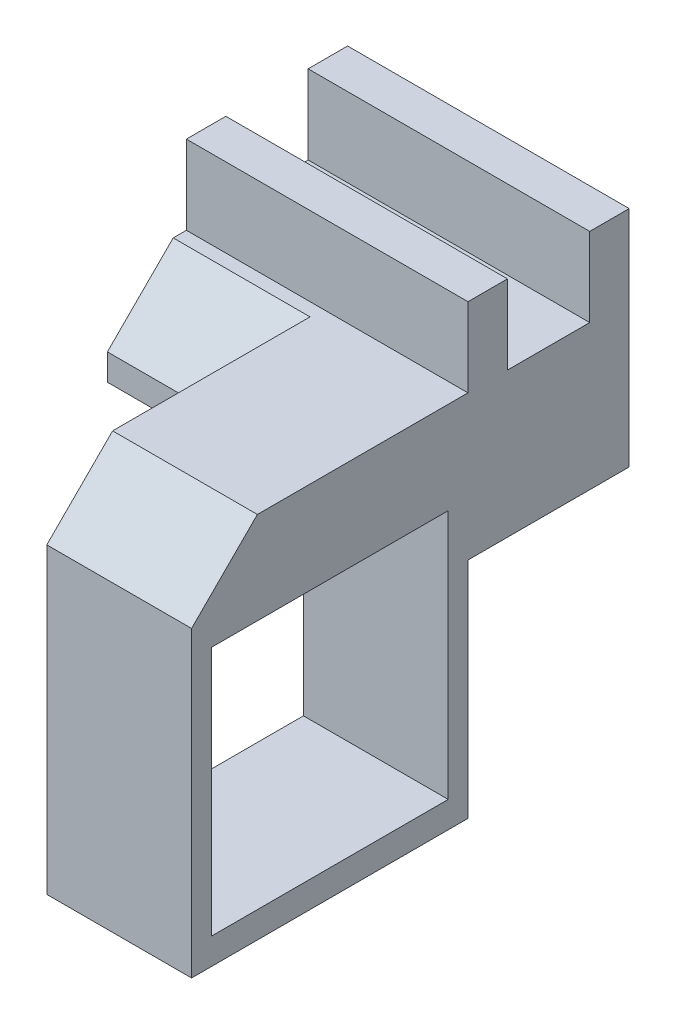
ISO-10303-21;
HEADER;
FILE_DESCRIPTION(('STEP AP214'),'2;1');
FILE_NAME('part.step','',(''),(''),'','','');
FILE_SCHEMA(('AUTOMOTIVE_DESIGN { 1 0 10303 214 1 1 1 1 }'));
ENDSEC;
DATA;
#1=APPLICATION_CONTEXT('core data for automotive mechanical design processes');
#2=APPLICATION_PROTOCOL_DEFINITION('international standard','automotive_design',2000,#1);
#3=PRODUCT_CONTEXT('',#1,'mechanical');
#4=PRODUCT('Part','Part','',(#3));
#5=PRODUCT_RELATED_PRODUCT_CATEGORY('part','',(#4));
#6=PRODUCT_DEFINITION_FORMATION('','',#4);
#7=PRODUCT_DEFINITION_CONTEXT('part definition',#1,'design');
#8=PRODUCT_DEFINITION('design','',#6,#7);
#9=PRODUCT_DEFINITION_SHAPE('','',#8);
#10=(LENGTH_UNIT() NAMED_UNIT(*) SI_UNIT(.MILLI.,.METRE.));
#11=(NAMED_UNIT(*) PLANE_ANGLE_UNIT() SI_UNIT($,.RADIAN.));
#12=(NAMED_UNIT(*) SI_UNIT($,.STERADIAN.) SOLID_ANGLE_UNIT());
#13=UNCERTAINTY_MEASURE_WITH_UNIT(LENGTH_MEASURE(1.E-05),#10,'distance_accuracy_value','');
#14=(GEOMETRIC_REPRESENTATION_CONTEXT(3) GLOBAL_UNCERTAINTY_ASSIGNED_CONTEXT((#13)) GLOBAL_UNIT_ASSIGNED_CONTEXT((#10,
#11,#12)) REPRESENTATION_CONTEXT('',''));
#15=CARTESIAN_POINT('',(0.,0.,0.));
#16=DIRECTION('',(0.,0.,1.));
#17=DIRECTION('',(1.,0.,0.));
#18=AXIS2_PLACEMENT_3D('',#15,#16,#17);
#19=CARTESIAN_POINT('',(0.,11.,0.));
#20=DIRECTION('',(0.,1.,0.));
#21=DIRECTION('',(0.,0.,1.));
#22=AXIS2_PLACEMENT_3D('',#19,#20,#21);
#23=PLANE('',#22);
#24=DIRECTION('',(0.,0.,-1.));
#25=VECTOR('',#24,1.);
#26=CARTESIAN_POINT('',(43.7350442610288,11.,18.5));
#27=LINE('',#26,#25);
#28=CARTESIAN_POINT('',(43.7350442610289,11.,50.5));
#29=VERTEX_POINT('',#28);
#30=CARTESIAN_POINT('',(43.7350442610289,11.,18.5));
#31=VERTEX_POINT('',#30);
#32=EDGE_CURVE('E234',#29,#31,#27,.T.);
#33=ORIENTED_EDGE('',*,*,#32,.T.);
#34=DIRECTION('',(-1.,0.,0.));
#35=VECTOR('',#34,1.);
#36=CARTESIAN_POINT('',(21.7350442610289,11.,18.5));
#37=LINE('',#36,#35);
#38=CARTESIAN_POINT('',(0.945063882776895,11.,18.5));
#39=VERTEX_POINT('',#38);
#40=EDGE_CURVE('E218',#31,#39,#37,.T.);
#41=ORIENTED_EDGE('',*,*,#40,.T.);
#42=DIRECTION('',(0.,0.,1.));
#43=VECTOR('',#42,1.);
#44=CARTESIAN_POINT('',(0.945063882776895,11.,18.5));
#45=LINE('',#44,#43);
#46=CARTESIAN_POINT('',(0.945063882776896,11.,20.5));
#47=VERTEX_POINT('',#46);
#48=EDGE_CURVE('E226',#39,#47,#45,.T.);
#49=ORIENTED_EDGE('',*,*,#48,.T.);
#50=DIRECTION('',(1.,0.,0.));
#51=VECTOR('',#50,1.);
#52=CARTESIAN_POINT('',(0.,11.,20.5));
#53=LINE('',#52,#51);
#54=CARTESIAN_POINT('',(21.7350442610289,11.,20.5));
#55=VERTEX_POINT('',#54);
#56=EDGE_CURVE('E411',#47,#55,#53,.T.);
#57=ORIENTED_EDGE('',*,*,#56,.T.);
#58=DIRECTION('',(0.,0.,1.));
#59=VECTOR('',#58,1.);
#60=CARTESIAN_POINT('',(21.7350442610289,11.,30.5));
#61=LINE('',#60,#59);
#62=CARTESIAN_POINT('',(21.7350442610289,11.,50.5));
#63=VERTEX_POINT('',#62);
#64=EDGE_CURVE('E268',#55,#63,#61,.T.);
#65=ORIENTED_EDGE('',*,*,#64,.T.);
#66=DIRECTION('',(1.,0.,0.));
#67=VECTOR('',#66,1.);
#68=CARTESIAN_POINT('',(0.,11.,50.5));
#69=LINE('',#68,#67);
#70=EDGE_CURVE('E246',#63,#29,#69,.T.);
#71=ORIENTED_EDGE('',*,*,#70,.T.);
#72=EDGE_LOOP('',(#33,#41,#49,#57,#65,#71));
#73=FACE_BOUND('',#72,.T.);
#74=ADVANCED_FACE('F72',(#73),#23,.T.);
#75=DIRECTION('',(1.,0.,0.));
#76=VECTOR('',#75,1.);
#77=CARTESIAN_POINT('',(0.945063882776894,11.,12.5));
#78=LINE('',#77,#76);
#79=CARTESIAN_POINT('',(0.945063882776894,11.,12.5));
#80=VERTEX_POINT('',#79);
#81=CARTESIAN_POINT('',(43.7350442610289,11.,12.5));
#82=VERTEX_POINT('',#81);
#83=EDGE_CURVE('E230',#80,#82,#78,.T.);
#84=ORIENTED_EDGE('',*,*,#83,.T.);
#85=CARTESIAN_POINT('',(43.7350442610289,11.,0.));
#86=VERTEX_POINT('',#85);
#87=EDGE_CURVE('E248',#82,#86,#27,.T.);
#88=ORIENTED_EDGE('',*,*,#87,.T.);
#89=DIRECTION('',(-1.,0.,0.));
#90=VECTOR('',#89,1.);
#91=CARTESIAN_POINT('',(21.7350442610289,11.,0.));
#92=LINE('',#91,#90);
#93=CARTESIAN_POINT('',(0.945063882776891,11.,0.));
#94=VERTEX_POINT('',#93);
#95=EDGE_CURVE('E247',#86,#94,#92,.T.);
#96=ORIENTED_EDGE('',*,*,#95,.T.);
#97=DIRECTION('',(0.,0.,1.));
#98=VECTOR('',#97,1.);
#99=CARTESIAN_POINT('',(0.945063882776891,11.,0.));
#100=LINE('',#99,#98);
#101=EDGE_CURVE('E254',#94,#80,#100,.T.);
#102=ORIENTED_EDGE('',*,*,#101,.T.);
#103=EDGE_LOOP('',(#84,#88,#96,#102));
#104=FACE_BOUND('',#103,.T.);
#105=ADVANCED_FACE('F518',(#104),#23,.T.);
#106=CARTESIAN_POINT('',(0.,-11.,0.));
#107=DIRECTION('',(0.,1.,0.));
#108=DIRECTION('',(0.,0.,1.));
#109=AXIS2_PLACEMENT_3D('',#106,#107,#108);
#110=PLANE('',#109);
#111=DIRECTION('',(0.,0.,-1.));
#112=VECTOR('',#111,1.);
#113=CARTESIAN_POINT('',(43.7350442610288,-11.,60.5));
#114=LINE('',#113,#112);
#115=CARTESIAN_POINT('',(43.7350442610288,-11.,18.5));
#116=VERTEX_POINT('',#115);
#117=CARTESIAN_POINT('',(43.7350442610288,-11.,-6.));
#118=VERTEX_POINT('',#117);
#119=EDGE_CURVE('E257',#116,#118,#114,.T.);
#120=ORIENTED_EDGE('',*,*,#119,.F.);
#121=DIRECTION('',(1.,0.,0.));
#122=VECTOR('',#121,1.);
#123=CARTESIAN_POINT('',(1.73504426102884,-11.,18.5));
#124=LINE('',#123,#122);
#125=CARTESIAN_POINT('',(21.7350442610289,-11.,18.5));
#126=VERTEX_POINT('',#125);
#127=EDGE_CURVE('E270',#126,#116,#124,.T.);
#128=ORIENTED_EDGE('',*,*,#127,.F.);
#129=DIRECTION('',(0.,0.,-1.));
#130=VECTOR('',#129,1.);
#131=CARTESIAN_POINT('',(21.7350442610289,-11.,30.5));
#132=LINE('',#131,#130);
#133=CARTESIAN_POINT('',(21.7350442610289,-11.,21.4999999999999));
#134=VERTEX_POINT('',#133);
#135=EDGE_CURVE('E377',#134,#126,#132,.T.);
#136=ORIENTED_EDGE('',*,*,#135,.F.);
#137=DIRECTION('',(-1.,0.,0.));
#138=VECTOR('',#137,1.);
#139=CARTESIAN_POINT('',(0.,-11.,21.4999999999999));
#140=LINE('',#139,#138);
#141=CARTESIAN_POINT('',(0.945063882776875,-11.,21.4999999999999));
#142=VERTEX_POINT('',#141);
#143=EDGE_CURVE('E303',#134,#142,#140,.T.);
#144=ORIENTED_EDGE('',*,*,#143,.T.);
#145=DIRECTION('',(0.,0.,1.));
#146=VECTOR('',#145,1.);
#147=CARTESIAN_POINT('',(0.945063882776895,-11.,18.5));
#148=LINE('',#147,#146);
#149=CARTESIAN_POINT('',(0.945063882776893,-11.,-6.));
#150=VERTEX_POINT('',#149);
#151=EDGE_CURVE('E369',#150,#142,#148,.T.);
#152=ORIENTED_EDGE('',*,*,#151,.F.);
#153=DIRECTION('',(1.,0.,0.));
#154=VECTOR('',#153,1.);
#155=CARTESIAN_POINT('',(0.,-11.,-6.));
#156=LINE('',#155,#154);
#157=EDGE_CURVE('E362',#150,#118,#156,.T.);
#158=ORIENTED_EDGE('',*,*,#157,.T.);
#159=EDGE_LOOP('',(#120,#128,#136,#144,#152,#158));
#160=FACE_BOUND('',#159,.T.);
#161=ADVANCED_FACE('F456',(#160),#110,.F.);
#162=CARTESIAN_POINT('',(0.945063882776893,23.,0.));
#163=DIRECTION('',(-1.,0.,0.));
#164=DIRECTION('',(0.,0.,1.));
#165=AXIS2_PLACEMENT_3D('',#162,#163,#164);
#166=PLANE('',#165);
#167=DIRECTION('',(0.,1.,0.));
#168=VECTOR('',#167,1.);
#169=CARTESIAN_POINT('',(0.945063882776898,-11.,30.5));
#170=LINE('',#169,#168);
#171=CARTESIAN_POINT('',(0.945063882776862,-3.,30.5));
#172=VERTEX_POINT('',#171);
#173=CARTESIAN_POINT('',(0.945063882776898,0.99999999999993,30.5));
#174=VERTEX_POINT('',#173);
#175=EDGE_CURVE('E366',#172,#174,#170,.T.);
#176=ORIENTED_EDGE('',*,*,#175,.T.);
#177=DIRECTION('',(0.,-0.707106781186549,0.707106781186546));
#178=VECTOR('',#177,1.);
#179=CARTESIAN_POINT('',(0.945063882776893,27.25,4.25000000000003));
#180=LINE('',#179,#178);
#181=EDGE_CURVE('E416',#174,#47,#180,.F.);
#182=ORIENTED_EDGE('',*,*,#181,.T.);
#183=ORIENTED_EDGE('',*,*,#48,.F.);
#184=DIRECTION('',(0.,-1.,0.));
#185=VECTOR('',#184,1.);
#186=CARTESIAN_POINT('',(0.945063882776895,23.,18.5));
#187=LINE('',#186,#185);
#188=CARTESIAN_POINT('',(0.945063882776895,23.,18.5));
#189=VERTEX_POINT('',#188);
#190=EDGE_CURVE('E224',#189,#39,#187,.T.);
#191=ORIENTED_EDGE('',*,*,#190,.F.);
#192=DIRECTION('',(0.,0.,1.));
#193=VECTOR('',#192,1.);
#194=CARTESIAN_POINT('',(0.945063882776893,23.,0.));
#195=LINE('',#194,#193);
#196=CARTESIAN_POINT('',(0.945063882776894,23.,12.5));
#197=VERTEX_POINT('',#196);
#198=EDGE_CURVE('E358',#197,#189,#195,.T.);
#199=ORIENTED_EDGE('',*,*,#198,.F.);
#200=DIRECTION('',(0.,-1.,0.));
#201=VECTOR('',#200,1.);
#202=CARTESIAN_POINT('',(0.945063882776894,23.,12.5));
#203=LINE('',#202,#201);
#204=EDGE_CURVE('E363',#197,#80,#203,.T.);
#205=ORIENTED_EDGE('',*,*,#204,.T.);
#206=ORIENTED_EDGE('',*,*,#101,.F.);
#207=DIRECTION('',(0.,-1.,0.));
#208=VECTOR('',#207,1.);
#209=CARTESIAN_POINT('',(0.945063882776893,23.,0.));
#210=LINE('',#209,#208);
#211=CARTESIAN_POINT('',(0.945063882776893,23.,0.));
#212=VERTEX_POINT('',#211);
#213=EDGE_CURVE('E398',#212,#94,#210,.T.);
#214=ORIENTED_EDGE('',*,*,#213,.F.);
#215=DIRECTION('',(0.,0.,-1.));
#216=VECTOR('',#215,1.);
#217=CARTESIAN_POINT('',(0.945063882776893,23.,0.));
#218=LINE('',#217,#216);
#219=CARTESIAN_POINT('',(0.945063882776893,23.,-6.));
#220=VERTEX_POINT('',#219);
#221=EDGE_CURVE('E389',#212,#220,#218,.T.);
#222=ORIENTED_EDGE('',*,*,#221,.T.);
#223=DIRECTION('',(0.,-1.,0.));
#224=VECTOR('',#223,1.);
#225=CARTESIAN_POINT('',(0.945063882776893,23.,-6.));
#226=LINE('',#225,#224);
#227=EDGE_CURVE('E396',#220,#150,#226,.T.);
#228=ORIENTED_EDGE('',*,*,#227,.T.);
#229=ORIENTED_EDGE('',*,*,#151,.T.);
#230=DIRECTION('',(0.,1.,0.));
#231=VECTOR('',#230,1.);
#232=CARTESIAN_POINT('',(0.945063882776875,0.,21.4999999999999));
#233=LINE('',#232,#231);
#234=CARTESIAN_POINT('',(0.945063882776875,-3.,21.4999999999999));
#235=VERTEX_POINT('',#234);
#236=EDGE_CURVE('E271',#142,#235,#233,.T.);
#237=ORIENTED_EDGE('',*,*,#236,.T.);
#238=DIRECTION('',(0.,0.,-1.));
#239=VECTOR('',#238,1.);
#240=CARTESIAN_POINT('',(0.945063882776889,-3.,0.));
#241=LINE('',#240,#239);
#242=EDGE_CURVE('E280',#172,#235,#241,.T.);
#243=ORIENTED_EDGE('',*,*,#242,.F.);
#244=EDGE_LOOP('',(#176,#182,#183,#191,#199,#205,#206,#214,#222,#228,#229,#237,#243));
#245=FACE_BOUND('',#244,.T.);
#246=ADVANCED_FACE('F463',(#245),#166,.T.);
#247=CARTESIAN_POINT('',(0.945063882776898,-11.,30.5));
#248=DIRECTION('',(0.,0.,1.));
#249=DIRECTION('',(1.,0.,0.));
#250=AXIS2_PLACEMENT_3D('',#247,#248,#249);
#251=PLANE('',#250);
#252=DIRECTION('',(0.,1.,0.));
#253=VECTOR('',#252,1.);
#254=CARTESIAN_POINT('',(21.7350442610289,-11.,30.5));
#255=LINE('',#254,#253);
#256=CARTESIAN_POINT('',(21.7350442610289,-3.,30.5));
#257=VERTEX_POINT('',#256);
#258=CARTESIAN_POINT('',(21.7350442610289,0.99999999999993,30.5));
#259=VERTEX_POINT('',#258);
#260=EDGE_CURVE('E371',#257,#259,#255,.T.);
#261=ORIENTED_EDGE('',*,*,#260,.T.);
#262=DIRECTION('',(-1.,0.,0.));
#263=VECTOR('',#262,1.);
#264=CARTESIAN_POINT('',(0.945063882776898,0.99999999999993,30.5));
#265=LINE('',#264,#263);
#266=EDGE_CURVE('E419',#259,#174,#265,.T.);
#267=ORIENTED_EDGE('',*,*,#266,.T.);
#268=ORIENTED_EDGE('',*,*,#175,.F.);
#269=DIRECTION('',(1.,0.,0.));
#270=VECTOR('',#269,1.);
#271=CARTESIAN_POINT('',(0.945063882776898,-3.,30.5));
#272=LINE('',#271,#270);
#273=EDGE_CURVE('E313',#172,#257,#272,.T.);
#274=ORIENTED_EDGE('',*,*,#273,.T.);
#275=EDGE_LOOP('',(#261,#267,#268,#274));
#276=FACE_BOUND('',#275,.T.);
#277=ADVANCED_FACE('F495',(#276),#251,.T.);
#278=CARTESIAN_POINT('',(43.7350442610289,-45.,0.));
#279=DIRECTION('',(1.,0.,0.));
#280=DIRECTION('',(0.,0.,-1.));
#281=AXIS2_PLACEMENT_3D('',#278,#279,#280);
#282=PLANE('',#281);
#283=DIRECTION('',(0.,1.,0.));
#284=VECTOR('',#283,1.);
#285=CARTESIAN_POINT('',(43.7350442610289,-45.,57.4999999999999));
#286=LINE('',#285,#284);
#287=CARTESIAN_POINT('',(43.7350442610289,-41.,57.4999999999999));
#288=VERTEX_POINT('',#287);
#289=CARTESIAN_POINT('',(43.7350442610289,-3.,57.4999999999999));
#290=VERTEX_POINT('',#289);
#291=EDGE_CURVE('E319',#288,#290,#286,.T.);
#292=ORIENTED_EDGE('',*,*,#291,.T.);
#293=DIRECTION('',(0.,0.,-1.));
#294=VECTOR('',#293,1.);
#295=CARTESIAN_POINT('',(43.7350442610289,-3.,0.));
#296=LINE('',#295,#294);
#297=CARTESIAN_POINT('',(43.7350442610288,-3.,21.4999999999999));
#298=VERTEX_POINT('',#297);
#299=EDGE_CURVE('E310',#290,#298,#296,.T.);
#300=ORIENTED_EDGE('',*,*,#299,.T.);
#301=DIRECTION('',(0.,1.,0.));
#302=VECTOR('',#301,1.);
#303=CARTESIAN_POINT('',(43.7350442610289,-45.,21.4999999999999));
#304=LINE('',#303,#302);
#305=CARTESIAN_POINT('',(43.7350442610289,-41.,21.4999999999999));
#306=VERTEX_POINT('',#305);
#307=EDGE_CURVE('E282',#306,#298,#304,.T.);
#308=ORIENTED_EDGE('',*,*,#307,.F.);
#309=DIRECTION('',(0.,0.,-1.));
#310=VECTOR('',#309,1.);
#311=CARTESIAN_POINT('',(43.7350442610289,-41.,0.));
#312=LINE('',#311,#310);
#313=EDGE_CURVE('E322',#288,#306,#312,.T.);
#314=ORIENTED_EDGE('',*,*,#313,.F.);
#315=EDGE_LOOP('',(#292,#300,#308,#314));
#316=FACE_BOUND('',#315,.T.);
#317=DIRECTION('',(0.,0.707106781186549,-0.707106781186546));
#318=VECTOR('',#317,1.);
#319=CARTESIAN_POINT('',(43.7350442610289,8.24999999999987,53.2500000000001));
#320=LINE('',#319,#318);
#321=CARTESIAN_POINT('',(43.7350442610289,0.999999999999918,60.5));
#322=VERTEX_POINT('',#321);
#323=EDGE_CURVE('E421',#29,#322,#320,.F.);
#324=ORIENTED_EDGE('',*,*,#323,.T.);
#325=DIRECTION('',(0.,1.,0.));
#326=VECTOR('',#325,1.);
#327=CARTESIAN_POINT('',(43.7350442610289,-45.,60.5));
#328=LINE('',#327,#326);
#329=CARTESIAN_POINT('',(43.7350442610289,-45.,60.5));
#330=VERTEX_POINT('',#329);
#331=EDGE_CURVE('E91',#330,#322,#328,.T.);
#332=ORIENTED_EDGE('',*,*,#331,.F.);
#333=DIRECTION('',(0.,0.,-1.));
#334=VECTOR('',#333,1.);
#335=CARTESIAN_POINT('',(43.7350442610289,-45.,0.));
#336=LINE('',#335,#334);
#337=CARTESIAN_POINT('',(43.7350442610288,-45.,18.5));
#338=VERTEX_POINT('',#337);
#339=EDGE_CURVE('E332',#330,#338,#336,.T.);
#340=ORIENTED_EDGE('',*,*,#339,.T.);
#341=DIRECTION('',(0.,1.,0.));
#342=VECTOR('',#341,1.);
#343=CARTESIAN_POINT('',(43.7350442610288,-45.,18.5));
#344=LINE('',#343,#342);
#345=EDGE_CURVE('E336',#338,#116,#344,.T.);
#346=ORIENTED_EDGE('',*,*,#345,.T.);
#347=ORIENTED_EDGE('',*,*,#119,.T.);
#348=DIRECTION('',(0.,1.,0.));
#349=VECTOR('',#348,1.);
#350=CARTESIAN_POINT('',(43.7350442610288,23.,-6.));
#351=LINE('',#350,#349);
#352=CARTESIAN_POINT('',(43.7350442610289,23.,-6.00000000000002));
#353=VERTEX_POINT('',#352);
#354=EDGE_CURVE('E449',#118,#353,#351,.T.);
#355=ORIENTED_EDGE('',*,*,#354,.T.);
#356=DIRECTION('',(0.,0.,1.));
#357=VECTOR('',#356,1.);
#358=CARTESIAN_POINT('',(43.7350442610289,23.,0.));
#359=LINE('',#358,#357);
#360=CARTESIAN_POINT('',(43.7350442610289,23.,0.));
#361=VERTEX_POINT('',#360);
#362=EDGE_CURVE('E467',#353,#361,#359,.T.);
#363=ORIENTED_EDGE('',*,*,#362,.T.);
#364=DIRECTION('',(0.,-1.,0.));
#365=VECTOR('',#364,1.);
#366=CARTESIAN_POINT('',(43.7350442610289,23.,0.));
#367=LINE('',#366,#365);
#368=EDGE_CURVE('E241',#361,#86,#367,.T.);
#369=ORIENTED_EDGE('',*,*,#368,.T.);
#370=ORIENTED_EDGE('',*,*,#87,.F.);
#371=DIRECTION('',(0.,1.,0.));
#372=VECTOR('',#371,1.);
#373=CARTESIAN_POINT('',(43.7350442610289,23.,12.5));
#374=LINE('',#373,#372);
#375=CARTESIAN_POINT('',(43.7350442610289,23.,12.5));
#376=VERTEX_POINT('',#375);
#377=EDGE_CURVE('E239',#82,#376,#374,.T.);
#378=ORIENTED_EDGE('',*,*,#377,.T.);
#379=DIRECTION('',(0.,0.,1.));
#380=VECTOR('',#379,1.);
#381=CARTESIAN_POINT('',(43.7350442610289,23.,18.5));
#382=LINE('',#381,#380);
#383=CARTESIAN_POINT('',(43.7350442610289,23.,18.5));
#384=VERTEX_POINT('',#383);
#385=EDGE_CURVE('E238',#376,#384,#382,.T.);
#386=ORIENTED_EDGE('',*,*,#385,.T.);
#387=DIRECTION('',(0.,-1.,0.));
#388=VECTOR('',#387,1.);
#389=CARTESIAN_POINT('',(43.7350442610289,23.,18.5));
#390=LINE('',#389,#388);
#391=EDGE_CURVE('E217',#384,#31,#390,.T.);
#392=ORIENTED_EDGE('',*,*,#391,.T.);
#393=ORIENTED_EDGE('',*,*,#32,.F.);
#394=EDGE_LOOP('',(#324,#332,#340,#346,#347,#355,#363,#369,#370,#378,#386,#392,#393));
#395=FACE_BOUND('',#394,.T.);
#396=ADVANCED_FACE('F231',(#316,#395),#282,.T.);
#397=CARTESIAN_POINT('',(0.,23.,-6.));
#398=DIRECTION('',(0.,0.,-1.));
#399=DIRECTION('',(-1.,0.,0.));
#400=AXIS2_PLACEMENT_3D('',#397,#398,#399);
#401=PLANE('',#400);
#402=ORIENTED_EDGE('',*,*,#354,.F.);
#403=ORIENTED_EDGE('',*,*,#157,.F.);
#404=ORIENTED_EDGE('',*,*,#227,.F.);
#405=DIRECTION('',(1.,0.,0.));
#406=VECTOR('',#405,1.);
#407=CARTESIAN_POINT('',(0.,23.,-6.));
#408=LINE('',#407,#406);
#409=EDGE_CURVE('E385',#220,#353,#408,.T.);
#410=ORIENTED_EDGE('',*,*,#409,.T.);
#411=EDGE_LOOP('',(#402,#403,#404,#410));
#412=FACE_BOUND('',#411,.T.);
#413=ADVANCED_FACE('F451',(#412),#401,.T.);
#414=CARTESIAN_POINT('',(0.,23.,0.));
#415=DIRECTION('',(0.,0.,1.));
#416=DIRECTION('',(1.,0.,0.));
#417=AXIS2_PLACEMENT_3D('',#414,#415,#416);
#418=PLANE('',#417);
#419=ORIENTED_EDGE('',*,*,#95,.F.);
#420=ORIENTED_EDGE('',*,*,#368,.F.);
#421=DIRECTION('',(-1.,0.,0.));
#422=VECTOR('',#421,1.);
#423=CARTESIAN_POINT('',(0.,23.,0.));
#424=LINE('',#423,#422);
#425=EDGE_CURVE('E395',#361,#212,#424,.T.);
#426=ORIENTED_EDGE('',*,*,#425,.T.);
#427=ORIENTED_EDGE('',*,*,#213,.T.);
#428=EDGE_LOOP('',(#419,#420,#426,#427));
#429=FACE_BOUND('',#428,.T.);
#430=ADVANCED_FACE('F558',(#429),#418,.T.);
#431=CARTESIAN_POINT('',(0.,23.,0.));
#432=DIRECTION('',(0.,1.,0.));
#433=DIRECTION('',(0.,0.,1.));
#434=AXIS2_PLACEMENT_3D('',#431,#432,#433);
#435=PLANE('',#434);
#436=ORIENTED_EDGE('',*,*,#425,.F.);
#437=ORIENTED_EDGE('',*,*,#362,.F.);
#438=ORIENTED_EDGE('',*,*,#409,.F.);
#439=ORIENTED_EDGE('',*,*,#221,.F.);
#440=EDGE_LOOP('',(#436,#437,#438,#439));
#441=FACE_BOUND('',#440,.T.);
#442=ADVANCED_FACE('F461',(#441),#435,.T.);
#443=CARTESIAN_POINT('',(0.,23.,18.5));
#444=DIRECTION('',(0.,0.,1.));
#445=DIRECTION('',(1.,0.,0.));
#446=AXIS2_PLACEMENT_3D('',#443,#444,#445);
#447=PLANE('',#446);
#448=ORIENTED_EDGE('',*,*,#40,.F.);
#449=ORIENTED_EDGE('',*,*,#391,.F.);
#450=DIRECTION('',(-1.,0.,0.));
#451=VECTOR('',#450,1.);
#452=CARTESIAN_POINT('',(0.,23.,18.5));
#453=LINE('',#452,#451);
#454=EDGE_CURVE('E345',#384,#189,#453,.T.);
#455=ORIENTED_EDGE('',*,*,#454,.T.);
#456=ORIENTED_EDGE('',*,*,#190,.T.);
#457=EDGE_LOOP('',(#448,#449,#455,#456));
#458=FACE_BOUND('',#457,.T.);
#459=ADVANCED_FACE('F216',(#458),#447,.T.);
#460=CARTESIAN_POINT('',(0.,23.,12.5));
#461=DIRECTION('',(0.,0.,-1.));
#462=DIRECTION('',(-1.,0.,0.));
#463=AXIS2_PLACEMENT_3D('',#460,#461,#462);
#464=PLANE('',#463);
#465=ORIENTED_EDGE('',*,*,#83,.F.);
#466=ORIENTED_EDGE('',*,*,#204,.F.);
#467=DIRECTION('',(1.,0.,0.));
#468=VECTOR('',#467,1.);
#469=CARTESIAN_POINT('',(0.,23.,12.5));
#470=LINE('',#469,#468);
#471=EDGE_CURVE('E352',#197,#376,#470,.T.);
#472=ORIENTED_EDGE('',*,*,#471,.T.);
#473=ORIENTED_EDGE('',*,*,#377,.F.);
#474=EDGE_LOOP('',(#465,#466,#472,#473));
#475=FACE_BOUND('',#474,.T.);
#476=ADVANCED_FACE('F542',(#475),#464,.T.);
#477=CARTESIAN_POINT('',(0.,23.,0.));
#478=DIRECTION('',(0.,1.,0.));
#479=DIRECTION('',(0.,0.,1.));
#480=AXIS2_PLACEMENT_3D('',#477,#478,#479);
#481=PLANE('',#480);
#482=ORIENTED_EDGE('',*,*,#454,.F.);
#483=ORIENTED_EDGE('',*,*,#385,.F.);
#484=ORIENTED_EDGE('',*,*,#471,.F.);
#485=ORIENTED_EDGE('',*,*,#198,.T.);
#486=EDGE_LOOP('',(#482,#483,#484,#485));
#487=FACE_BOUND('',#486,.T.);
#488=ADVANCED_FACE('F482',(#487),#481,.T.);
#489=CARTESIAN_POINT('',(0.,-45.,18.5));
#490=DIRECTION('',(0.,0.,1.));
#491=DIRECTION('',(1.,0.,0.));
#492=AXIS2_PLACEMENT_3D('',#489,#490,#491);
#493=PLANE('',#492);
#494=DIRECTION('',(0.,1.,0.));
#495=VECTOR('',#494,1.);
#496=CARTESIAN_POINT('',(21.7350442610289,-45.,18.5));
#497=LINE('',#496,#495);
#498=CARTESIAN_POINT('',(21.7350442610289,-45.,18.5));
#499=VERTEX_POINT('',#498);
#500=EDGE_CURVE('E340',#499,#126,#497,.T.);
#501=ORIENTED_EDGE('',*,*,#500,.T.);
#502=ORIENTED_EDGE('',*,*,#127,.T.);
#503=ORIENTED_EDGE('',*,*,#345,.F.);
#504=DIRECTION('',(1.,0.,0.));
#505=VECTOR('',#504,1.);
#506=CARTESIAN_POINT('',(0.,-45.,18.5));
#507=LINE('',#506,#505);
#508=EDGE_CURVE('E321',#499,#338,#507,.T.);
#509=ORIENTED_EDGE('',*,*,#508,.F.);
#510=EDGE_LOOP('',(#501,#502,#503,#509));
#511=FACE_BOUND('',#510,.T.);
#512=ADVANCED_FACE('F443',(#511),#493,.F.);
#513=CARTESIAN_POINT('',(0.,-45.,60.5));
#514=DIRECTION('',(0.,0.,1.));
#515=DIRECTION('',(1.,0.,0.));
#516=AXIS2_PLACEMENT_3D('',#513,#514,#515);
#517=PLANE('',#516);
#518=ORIENTED_EDGE('',*,*,#331,.T.);
#519=DIRECTION('',(-1.,0.,0.));
#520=VECTOR('',#519,1.);
#521=CARTESIAN_POINT('',(0.,0.999999999999931,60.5));
#522=LINE('',#521,#520);
#523=CARTESIAN_POINT('',(21.7350442610289,0.999999999999918,60.5));
#524=VERTEX_POINT('',#523);
#525=EDGE_CURVE('E87',#322,#524,#522,.T.);
#526=ORIENTED_EDGE('',*,*,#525,.T.);
#527=DIRECTION('',(0.,1.,0.));
#528=VECTOR('',#527,1.);
#529=CARTESIAN_POINT('',(21.7350442610289,-45.,60.5));
#530=LINE('',#529,#528);
#531=CARTESIAN_POINT('',(21.7350442610289,-45.,60.5));
#532=VERTEX_POINT('',#531);
#533=EDGE_CURVE('E343',#532,#524,#530,.T.);
#534=ORIENTED_EDGE('',*,*,#533,.F.);
#535=DIRECTION('',(1.,0.,0.));
#536=VECTOR('',#535,1.);
#537=CARTESIAN_POINT('',(0.,-45.,60.5));
#538=LINE('',#537,#536);
#539=EDGE_CURVE('E327',#532,#330,#538,.T.);
#540=ORIENTED_EDGE('',*,*,#539,.T.);
#541=EDGE_LOOP('',(#518,#526,#534,#540));
#542=FACE_BOUND('',#541,.T.);
#543=ADVANCED_FACE('F440',(#542),#517,.T.);
#544=CARTESIAN_POINT('',(21.7350442610289,-45.,0.));
#545=DIRECTION('',(1.,0.,0.));
#546=DIRECTION('',(0.,0.,-1.));
#547=AXIS2_PLACEMENT_3D('',#544,#545,#546);
#548=PLANE('',#547);
#549=ORIENTED_EDGE('',*,*,#533,.T.);
#550=DIRECTION('',(0.,-0.707106781186549,0.707106781186546));
#551=VECTOR('',#550,1.);
#552=CARTESIAN_POINT('',(21.7350442610289,11.,50.5));
#553=LINE('',#552,#551);
#554=EDGE_CURVE('E84',#524,#63,#553,.F.);
#555=ORIENTED_EDGE('',*,*,#554,.T.);
#556=ORIENTED_EDGE('',*,*,#64,.F.);
#557=DIRECTION('',(0.,0.707106781186549,-0.707106781186546));
#558=VECTOR('',#557,1.);
#559=CARTESIAN_POINT('',(21.7350442610289,-6.75000000000013,38.25));
#560=LINE('',#559,#558);
#561=EDGE_CURVE('E12',#55,#259,#560,.F.);
#562=ORIENTED_EDGE('',*,*,#561,.T.);
#563=ORIENTED_EDGE('',*,*,#260,.F.);
#564=DIRECTION('',(0.,0.,-1.));
#565=VECTOR('',#564,1.);
#566=CARTESIAN_POINT('',(21.7350442610289,-3.,0.));
#567=LINE('',#566,#565);
#568=CARTESIAN_POINT('',(21.7350442610288,-3.,57.5));
#569=VERTEX_POINT('',#568);
#570=EDGE_CURVE('E311',#569,#257,#567,.T.);
#571=ORIENTED_EDGE('',*,*,#570,.F.);
#572=DIRECTION('',(0.,1.,0.));
#573=VECTOR('',#572,1.);
#574=CARTESIAN_POINT('',(21.7350442610288,-45.,57.4999999999999));
#575=LINE('',#574,#573);
#576=CARTESIAN_POINT('',(21.7350442610288,-41.,57.4999999999999));
#577=VERTEX_POINT('',#576);
#578=EDGE_CURVE('E401',#577,#569,#575,.T.);
#579=ORIENTED_EDGE('',*,*,#578,.F.);
#580=DIRECTION('',(0.,0.,-1.));
#581=VECTOR('',#580,1.);
#582=CARTESIAN_POINT('',(21.7350442610289,-41.,0.));
#583=LINE('',#582,#581);
#584=CARTESIAN_POINT('',(21.7350442610289,-41.,21.4999999999999));
#585=VERTEX_POINT('',#584);
#586=EDGE_CURVE('E410',#577,#585,#583,.T.);
#587=ORIENTED_EDGE('',*,*,#586,.T.);
#588=DIRECTION('',(0.,1.,0.));
#589=VECTOR('',#588,1.);
#590=CARTESIAN_POINT('',(21.7350442610289,-45.,21.4999999999999));
#591=LINE('',#590,#589);
#592=EDGE_CURVE('E299',#585,#134,#591,.T.);
#593=ORIENTED_EDGE('',*,*,#592,.T.);
#594=ORIENTED_EDGE('',*,*,#135,.T.);
#595=ORIENTED_EDGE('',*,*,#500,.F.);
#596=DIRECTION('',(0.,0.,-1.));
#597=VECTOR('',#596,1.);
#598=CARTESIAN_POINT('',(21.7350442610289,-45.,0.));
#599=LINE('',#598,#597);
#600=EDGE_CURVE('E330',#532,#499,#599,.T.);
#601=ORIENTED_EDGE('',*,*,#600,.F.);
#602=EDGE_LOOP('',(#549,#555,#556,#562,#563,#571,#579,#587,#593,#594,#595,#601));
#603=FACE_BOUND('',#602,.T.);
#604=ADVANCED_FACE('F427',(#603),#548,.F.);
#605=CARTESIAN_POINT('',(0.,-45.,0.));
#606=DIRECTION('',(0.,1.,0.));
#607=DIRECTION('',(0.,0.,1.));
#608=AXIS2_PLACEMENT_3D('',#605,#606,#607);
#609=PLANE('',#608);
#610=ORIENTED_EDGE('',*,*,#508,.T.);
#611=ORIENTED_EDGE('',*,*,#339,.F.);
#612=ORIENTED_EDGE('',*,*,#539,.F.);
#613=ORIENTED_EDGE('',*,*,#600,.T.);
#614=EDGE_LOOP('',(#610,#611,#612,#613));
#615=FACE_BOUND('',#614,.T.);
#616=ADVANCED_FACE('F437',(#615),#609,.F.);
#617=CARTESIAN_POINT('',(0.945063882776889,-41.,0.));
#618=DIRECTION('',(0.,-1.,0.));
#619=DIRECTION('',(0.,0.,-1.));
#620=AXIS2_PLACEMENT_3D('',#617,#618,#619);
#621=PLANE('',#620);
#622=ORIENTED_EDGE('',*,*,#313,.T.);
#623=DIRECTION('',(1.,0.,0.));
#624=VECTOR('',#623,1.);
#625=CARTESIAN_POINT('',(0.945063882776875,-41.,21.4999999999999));
#626=LINE('',#625,#624);
#627=EDGE_CURVE('E283',#585,#306,#626,.T.);
#628=ORIENTED_EDGE('',*,*,#627,.F.);
#629=ORIENTED_EDGE('',*,*,#586,.F.);
#630=DIRECTION('',(1.,0.,0.));
#631=VECTOR('',#630,1.);
#632=CARTESIAN_POINT('',(0.945063882776834,-41.,57.4999999999999));
#633=LINE('',#632,#631);
#634=EDGE_CURVE('E288',#577,#288,#633,.T.);
#635=ORIENTED_EDGE('',*,*,#634,.T.);
#636=EDGE_LOOP('',(#622,#628,#629,#635));
#637=FACE_BOUND('',#636,.T.);
#638=ADVANCED_FACE('F502',(#637),#621,.F.);
#639=CARTESIAN_POINT('',(0.945063882776834,0.,57.4999999999999));
#640=DIRECTION('',(0.,0.,-1.));
#641=DIRECTION('',(-1.,0.,0.));
#642=AXIS2_PLACEMENT_3D('',#639,#640,#641);
#643=PLANE('',#642);
#644=ORIENTED_EDGE('',*,*,#634,.F.);
#645=ORIENTED_EDGE('',*,*,#578,.T.);
#646=DIRECTION('',(1.,0.,0.));
#647=VECTOR('',#646,1.);
#648=CARTESIAN_POINT('',(0.945063882776834,-3.,57.4999999999999));
#649=LINE('',#648,#647);
#650=EDGE_CURVE('E286',#569,#290,#649,.T.);
#651=ORIENTED_EDGE('',*,*,#650,.T.);
#652=ORIENTED_EDGE('',*,*,#291,.F.);
#653=EDGE_LOOP('',(#644,#645,#651,#652));
#654=FACE_BOUND('',#653,.T.);
#655=ADVANCED_FACE('F501',(#654),#643,.T.);
#656=CARTESIAN_POINT('',(0.945063882776875,0.,21.4999999999999));
#657=DIRECTION('',(0.,0.,-1.));
#658=DIRECTION('',(-1.,0.,0.));
#659=AXIS2_PLACEMENT_3D('',#656,#657,#658);
#660=PLANE('',#659);
#661=ORIENTED_EDGE('',*,*,#307,.T.);
#662=DIRECTION('',(1.,0.,0.));
#663=VECTOR('',#662,1.);
#664=CARTESIAN_POINT('',(0.945063882776875,-3.,21.4999999999999));
#665=LINE('',#664,#663);
#666=EDGE_CURVE('E278',#235,#298,#665,.T.);
#667=ORIENTED_EDGE('',*,*,#666,.F.);
#668=ORIENTED_EDGE('',*,*,#236,.F.);
#669=ORIENTED_EDGE('',*,*,#143,.F.);
#670=ORIENTED_EDGE('',*,*,#592,.F.);
#671=ORIENTED_EDGE('',*,*,#627,.T.);
#672=EDGE_LOOP('',(#661,#667,#668,#669,#670,#671));
#673=FACE_BOUND('',#672,.T.);
#674=ADVANCED_FACE('F508',(#673),#660,.F.);
#675=CARTESIAN_POINT('',(0.945063882776889,-3.,0.));
#676=DIRECTION('',(0.,-1.,0.));
#677=DIRECTION('',(0.,0.,-1.));
#678=AXIS2_PLACEMENT_3D('',#675,#676,#677);
#679=PLANE('',#678);
#680=ORIENTED_EDGE('',*,*,#666,.T.);
#681=ORIENTED_EDGE('',*,*,#299,.F.);
#682=ORIENTED_EDGE('',*,*,#650,.F.);
#683=ORIENTED_EDGE('',*,*,#570,.T.);
#684=ORIENTED_EDGE('',*,*,#273,.F.);
#685=ORIENTED_EDGE('',*,*,#242,.T.);
#686=EDGE_LOOP('',(#680,#681,#682,#683,#684,#685));
#687=FACE_BOUND('',#686,.T.);
#688=ADVANCED_FACE('F492',(#687),#679,.T.);
#689=CARTESIAN_POINT('',(0.,11.,20.5));
#690=DIRECTION('',(0.,-0.707106781186546,-0.707106781186549));
#691=DIRECTION('',(1.,0.,0.));
#692=AXIS2_PLACEMENT_3D('',#689,#690,#691);
#693=PLANE('',#692);
#694=ORIENTED_EDGE('',*,*,#181,.F.);
#695=ORIENTED_EDGE('',*,*,#266,.F.);
#696=ORIENTED_EDGE('',*,*,#561,.F.);
#697=ORIENTED_EDGE('',*,*,#56,.F.);
#698=EDGE_LOOP('',(#694,#695,#696,#697));
#699=FACE_BOUND('',#698,.T.);
#700=ADVANCED_FACE('F487',(#699),#693,.F.);
#701=CARTESIAN_POINT('',(0.,11.,50.5));
#702=DIRECTION('',(0.,-0.707106781186546,-0.707106781186549));
#703=DIRECTION('',(1.,0.,0.));
#704=AXIS2_PLACEMENT_3D('',#701,#702,#703);
#705=PLANE('',#704);
#706=ORIENTED_EDGE('',*,*,#554,.F.);
#707=ORIENTED_EDGE('',*,*,#525,.F.);
#708=ORIENTED_EDGE('',*,*,#323,.F.);
#709=ORIENTED_EDGE('',*,*,#70,.F.);
#710=EDGE_LOOP('',(#706,#707,#708,#709));
#711=FACE_BOUND('',#710,.T.);
#712=ADVANCED_FACE('F77',(#711),#705,.F.);
#713=CLOSED_SHELL('',(#74,#105,#161,#246,#277,#396,#413,#430,#442,#459,#476,#488,#512,#543,#604,
#616,#638,#655,#674,#688,#700,#712));
#714=MANIFOLD_SOLID_BREP('B2',#713);
#715=ADVANCED_BREP_SHAPE_REPRESENTATION('',(#18,#714),#14);
#716=SHAPE_DEFINITION_REPRESENTATION(#9,#715);
ENDSEC;
END-ISO-10303-21;
